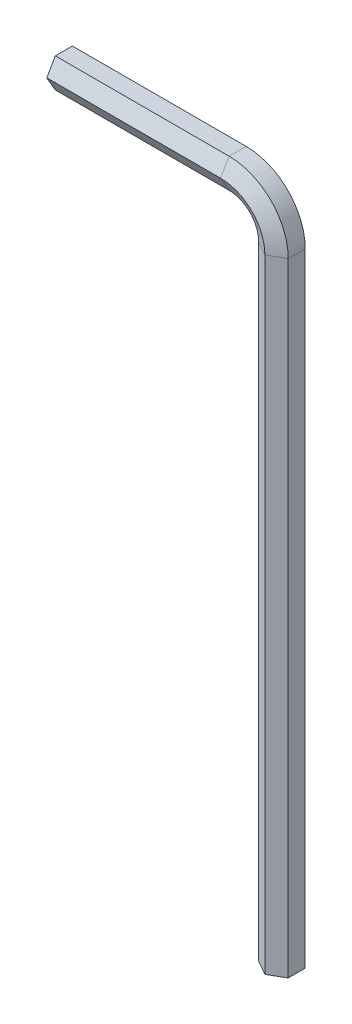
ISO-10303-21;
HEADER;
FILE_DESCRIPTION(('STEP AP214'),'2;1');
FILE_NAME('part.step','',(''),(''),'','','');
FILE_SCHEMA(('AUTOMOTIVE_DESIGN { 1 0 10303 214 1 1 1 1 }'));
ENDSEC;
DATA;
#1=APPLICATION_CONTEXT('core data for automotive mechanical design processes');
#2=APPLICATION_PROTOCOL_DEFINITION('international standard','automotive_design',2000,#1);
#3=PRODUCT_CONTEXT('',#1,'mechanical');
#4=PRODUCT('Part','Part','',(#3));
#5=PRODUCT_RELATED_PRODUCT_CATEGORY('part','',(#4));
#6=PRODUCT_DEFINITION_FORMATION('','',#4);
#7=PRODUCT_DEFINITION_CONTEXT('part definition',#1,'design');
#8=PRODUCT_DEFINITION('design','',#6,#7);
#9=PRODUCT_DEFINITION_SHAPE('','',#8);
#10=(LENGTH_UNIT() NAMED_UNIT(*) SI_UNIT(.MILLI.,.METRE.));
#11=(NAMED_UNIT(*) PLANE_ANGLE_UNIT() SI_UNIT($,.RADIAN.));
#12=(NAMED_UNIT(*) SI_UNIT($,.STERADIAN.) SOLID_ANGLE_UNIT());
#13=UNCERTAINTY_MEASURE_WITH_UNIT(LENGTH_MEASURE(1.E-05),#10,'distance_accuracy_value','');
#14=(GEOMETRIC_REPRESENTATION_CONTEXT(3) GLOBAL_UNCERTAINTY_ASSIGNED_CONTEXT((#13)) GLOBAL_UNIT_ASSIGNED_CONTEXT((#10,
#11,#12)) REPRESENTATION_CONTEXT('',''));
#15=CARTESIAN_POINT('',(0.,0.,0.));
#16=DIRECTION('',(0.,0.,1.));
#17=DIRECTION('',(1.,0.,0.));
#18=AXIS2_PLACEMENT_3D('',#15,#16,#17);
#19=CARTESIAN_POINT('',(0.,0.,0.));
#20=DIRECTION('',(0.,1.,0.));
#21=DIRECTION('',(0.,0.,1.));
#22=AXIS2_PLACEMENT_3D('',#19,#20,#21);
#23=PLANE('',#22);
#24=DIRECTION('',(-0.866025403784439,0.,-0.5));
#25=VECTOR('',#24,1.);
#26=CARTESIAN_POINT('',(1.25,0.,-0.721687836487033));
#27=LINE('',#26,#25);
#28=CARTESIAN_POINT('',(1.25,0.,-0.721687836487033));
#29=VERTEX_POINT('',#28);
#30=CARTESIAN_POINT('',(0.,0.,-1.44337567297406));
#31=VERTEX_POINT('',#30);
#32=EDGE_CURVE('E184',#29,#31,#27,.T.);
#33=ORIENTED_EDGE('',*,*,#32,.F.);
#34=DIRECTION('',(0.,0.,-1.));
#35=VECTOR('',#34,1.);
#36=CARTESIAN_POINT('',(1.25,0.,0.721687836487032));
#37=LINE('',#36,#35);
#38=CARTESIAN_POINT('',(1.25,0.,0.721687836487032));
#39=VERTEX_POINT('',#38);
#40=EDGE_CURVE('E226',#39,#29,#37,.T.);
#41=ORIENTED_EDGE('',*,*,#40,.F.);
#42=DIRECTION('',(0.866025403784439,0.,-0.5));
#43=VECTOR('',#42,1.);
#44=CARTESIAN_POINT('',(0.,0.,1.44337567297406));
#45=LINE('',#44,#43);
#46=CARTESIAN_POINT('',(0.,0.,1.44337567297406));
#47=VERTEX_POINT('',#46);
#48=EDGE_CURVE('E213',#47,#39,#45,.T.);
#49=ORIENTED_EDGE('',*,*,#48,.F.);
#50=DIRECTION('',(0.866025403784439,0.,0.5));
#51=VECTOR('',#50,1.);
#52=CARTESIAN_POINT('',(-1.25,0.,0.721687836487032));
#53=LINE('',#52,#51);
#54=CARTESIAN_POINT('',(-1.25,0.,0.721687836487032));
#55=VERTEX_POINT('',#54);
#56=EDGE_CURVE('E136',#55,#47,#53,.T.);
#57=ORIENTED_EDGE('',*,*,#56,.F.);
#58=DIRECTION('',(0.,0.,1.));
#59=VECTOR('',#58,1.);
#60=CARTESIAN_POINT('',(-1.25,0.,-0.721687836487032));
#61=LINE('',#60,#59);
#62=CARTESIAN_POINT('',(-1.25,0.,-0.721687836487032));
#63=VERTEX_POINT('',#62);
#64=EDGE_CURVE('E140',#63,#55,#61,.T.);
#65=ORIENTED_EDGE('',*,*,#64,.F.);
#66=DIRECTION('',(-0.866025403784438,0.,0.5));
#67=VECTOR('',#66,1.);
#68=CARTESIAN_POINT('',(0.,0.,-1.44337567297406));
#69=LINE('',#68,#67);
#70=EDGE_CURVE('E145',#31,#63,#69,.T.);
#71=ORIENTED_EDGE('',*,*,#70,.F.);
#72=EDGE_LOOP('',(#33,#41,#49,#57,#65,#71));
#73=FACE_BOUND('',#72,.T.);
#74=ADVANCED_FACE('F35',(#73),#23,.F.);
#75=CARTESIAN_POINT('',(-18.45,56.45,0.));
#76=DIRECTION('',(-1.,0.,0.));
#77=DIRECTION('',(0.,0.,1.));
#78=AXIS2_PLACEMENT_3D('',#75,#76,#77);
#79=PLANE('',#78);
#80=DIRECTION('',(0.,-0.866025403784439,-0.5));
#81=VECTOR('',#80,1.);
#82=CARTESIAN_POINT('',(-18.45,57.7,-0.721687836487033));
#83=LINE('',#82,#81);
#84=CARTESIAN_POINT('',(-18.45,57.7,-0.721687836487033));
#85=VERTEX_POINT('',#84);
#86=CARTESIAN_POINT('',(-18.45,56.45,-1.44337567297406));
#87=VERTEX_POINT('',#86);
#88=EDGE_CURVE('E156',#85,#87,#83,.T.);
#89=ORIENTED_EDGE('',*,*,#88,.T.);
#90=DIRECTION('',(0.,-0.866025403784438,0.5));
#91=VECTOR('',#90,1.);
#92=CARTESIAN_POINT('',(-18.45,56.45,-1.44337567297406));
#93=LINE('',#92,#91);
#94=CARTESIAN_POINT('',(-18.45,55.2,-0.721687836487032));
#95=VERTEX_POINT('',#94);
#96=EDGE_CURVE('E159',#87,#95,#93,.T.);
#97=ORIENTED_EDGE('',*,*,#96,.T.);
#98=DIRECTION('',(0.,0.,1.));
#99=VECTOR('',#98,1.);
#100=CARTESIAN_POINT('',(-18.45,55.2,-0.721687836487032));
#101=LINE('',#100,#99);
#102=CARTESIAN_POINT('',(-18.45,55.2,0.721687836487032));
#103=VERTEX_POINT('',#102);
#104=EDGE_CURVE('E199',#95,#103,#101,.T.);
#105=ORIENTED_EDGE('',*,*,#104,.T.);
#106=DIRECTION('',(0.,0.866025403784439,0.5));
#107=VECTOR('',#106,1.);
#108=CARTESIAN_POINT('',(-18.45,55.2,0.721687836487032));
#109=LINE('',#108,#107);
#110=CARTESIAN_POINT('',(-18.45,56.45,1.44337567297406));
#111=VERTEX_POINT('',#110);
#112=EDGE_CURVE('E54',#103,#111,#109,.T.);
#113=ORIENTED_EDGE('',*,*,#112,.T.);
#114=DIRECTION('',(0.,0.866025403784439,-0.5));
#115=VECTOR('',#114,1.);
#116=CARTESIAN_POINT('',(-18.45,56.45,1.44337567297406));
#117=LINE('',#116,#115);
#118=CARTESIAN_POINT('',(-18.45,57.7,0.721687836487032));
#119=VERTEX_POINT('',#118);
#120=EDGE_CURVE('E48',#111,#119,#117,.T.);
#121=ORIENTED_EDGE('',*,*,#120,.T.);
#122=DIRECTION('',(0.,0.,-1.));
#123=VECTOR('',#122,1.);
#124=CARTESIAN_POINT('',(-18.45,57.7,0.721687836487032));
#125=LINE('',#124,#123);
#126=EDGE_CURVE('E11',#119,#85,#125,.T.);
#127=ORIENTED_EDGE('',*,*,#126,.T.);
#128=EDGE_LOOP('',(#89,#97,#105,#113,#121,#127));
#129=FACE_BOUND('',#128,.T.);
#130=ADVANCED_FACE('F158',(#129),#79,.T.);
#131=CARTESIAN_POINT('',(1.25,0.,-0.721687836487033));
#132=DIRECTION('',(0.5,0.,-0.866025403784439));
#133=DIRECTION('',(-0.866025403784439,0.,-0.5));
#134=AXIS2_PLACEMENT_3D('',#131,#132,#133);
#135=PLANE('',#134);
#136=DIRECTION('',(0.,1.,0.));
#137=VECTOR('',#136,1.);
#138=CARTESIAN_POINT('',(0.,0.,-1.44337567297406));
#139=LINE('',#138,#137);
#140=CARTESIAN_POINT('',(0.,52.7,-1.44337567297406));
#141=VERTEX_POINT('',#140);
#142=EDGE_CURVE('E189',#31,#141,#139,.T.);
#143=ORIENTED_EDGE('',*,*,#142,.T.);
#144=DIRECTION('',(-0.866025403784439,0.,-0.5));
#145=VECTOR('',#144,1.);
#146=CARTESIAN_POINT('',(1.25,52.7,-0.721687836487033));
#147=LINE('',#146,#145);
#148=CARTESIAN_POINT('',(1.25,52.7,-0.721687836487033));
#149=VERTEX_POINT('',#148);
#150=EDGE_CURVE('E258',#149,#141,#147,.T.);
#151=ORIENTED_EDGE('',*,*,#150,.F.);
#152=DIRECTION('',(0.,1.,0.));
#153=VECTOR('',#152,1.);
#154=CARTESIAN_POINT('',(1.25,0.,-0.721687836487033));
#155=LINE('',#154,#153);
#156=EDGE_CURVE('E240',#29,#149,#155,.T.);
#157=ORIENTED_EDGE('',*,*,#156,.F.);
#158=ORIENTED_EDGE('',*,*,#32,.T.);
#159=EDGE_LOOP('',(#143,#151,#157,#158));
#160=FACE_BOUND('',#159,.T.);
#161=ADVANCED_FACE('F265',(#160),#135,.T.);
#162=CARTESIAN_POINT('',(0.,0.,-1.44337567297406));
#163=DIRECTION('',(-0.5,0.,-0.866025403784438));
#164=DIRECTION('',(-0.866025403784439,0.,0.5));
#165=AXIS2_PLACEMENT_3D('',#162,#163,#164);
#166=PLANE('',#165);
#167=DIRECTION('',(0.,1.,0.));
#168=VECTOR('',#167,1.);
#169=CARTESIAN_POINT('',(-1.25,0.,-0.721687836487032));
#170=LINE('',#169,#168);
#171=CARTESIAN_POINT('',(-1.25,52.7,-0.721687836487032));
#172=VERTEX_POINT('',#171);
#173=EDGE_CURVE('E188',#63,#172,#170,.T.);
#174=ORIENTED_EDGE('',*,*,#173,.T.);
#175=DIRECTION('',(-0.866025403784438,0.,0.5));
#176=VECTOR('',#175,1.);
#177=CARTESIAN_POINT('',(0.,52.7,-1.44337567297406));
#178=LINE('',#177,#176);
#179=EDGE_CURVE('E185',#141,#172,#178,.T.);
#180=ORIENTED_EDGE('',*,*,#179,.F.);
#181=ORIENTED_EDGE('',*,*,#142,.F.);
#182=ORIENTED_EDGE('',*,*,#70,.T.);
#183=EDGE_LOOP('',(#174,#180,#181,#182));
#184=FACE_BOUND('',#183,.T.);
#185=ADVANCED_FACE('F268',(#184),#166,.T.);
#186=CARTESIAN_POINT('',(-1.25,0.,-0.721687836487032));
#187=DIRECTION('',(-1.,0.,0.));
#188=DIRECTION('',(0.,-1.,0.));
#189=AXIS2_PLACEMENT_3D('',#186,#187,#188);
#190=PLANE('',#189);
#191=DIRECTION('',(0.,1.,0.));
#192=VECTOR('',#191,1.);
#193=CARTESIAN_POINT('',(-1.25,0.,0.721687836487032));
#194=LINE('',#193,#192);
#195=CARTESIAN_POINT('',(-1.25,52.7,0.721687836487032));
#196=VERTEX_POINT('',#195);
#197=EDGE_CURVE('E202',#55,#196,#194,.T.);
#198=ORIENTED_EDGE('',*,*,#197,.T.);
#199=DIRECTION('',(0.,0.,1.));
#200=VECTOR('',#199,1.);
#201=CARTESIAN_POINT('',(-1.25,52.7,-0.721687836487032));
#202=LINE('',#201,#200);
#203=EDGE_CURVE('E192',#172,#196,#202,.T.);
#204=ORIENTED_EDGE('',*,*,#203,.F.);
#205=ORIENTED_EDGE('',*,*,#173,.F.);
#206=ORIENTED_EDGE('',*,*,#64,.T.);
#207=EDGE_LOOP('',(#198,#204,#205,#206));
#208=FACE_BOUND('',#207,.T.);
#209=ADVANCED_FACE('F322',(#208),#190,.T.);
#210=CARTESIAN_POINT('',(-1.25,0.,0.721687836487032));
#211=DIRECTION('',(-0.5,0.,0.866025403784439));
#212=DIRECTION('',(0.866025403784439,0.,0.5));
#213=AXIS2_PLACEMENT_3D('',#210,#211,#212);
#214=PLANE('',#213);
#215=DIRECTION('',(0.,1.,0.));
#216=VECTOR('',#215,1.);
#217=CARTESIAN_POINT('',(0.,0.,1.44337567297406));
#218=LINE('',#217,#216);
#219=CARTESIAN_POINT('',(0.,52.7,1.44337567297406));
#220=VERTEX_POINT('',#219);
#221=EDGE_CURVE('E215',#47,#220,#218,.T.);
#222=ORIENTED_EDGE('',*,*,#221,.T.);
#223=DIRECTION('',(0.866025403784439,0.,0.5));
#224=VECTOR('',#223,1.);
#225=CARTESIAN_POINT('',(-1.25,52.7,0.721687836487032));
#226=LINE('',#225,#224);
#227=EDGE_CURVE('E205',#196,#220,#226,.T.);
#228=ORIENTED_EDGE('',*,*,#227,.F.);
#229=ORIENTED_EDGE('',*,*,#197,.F.);
#230=ORIENTED_EDGE('',*,*,#56,.T.);
#231=EDGE_LOOP('',(#222,#228,#229,#230));
#232=FACE_BOUND('',#231,.T.);
#233=ADVANCED_FACE('F330',(#232),#214,.T.);
#234=CARTESIAN_POINT('',(0.,0.,1.44337567297406));
#235=DIRECTION('',(0.5,0.,0.866025403784439));
#236=DIRECTION('',(0.866025403784439,0.,-0.5));
#237=AXIS2_PLACEMENT_3D('',#234,#235,#236);
#238=PLANE('',#237);
#239=DIRECTION('',(0.,1.,0.));
#240=VECTOR('',#239,1.);
#241=CARTESIAN_POINT('',(1.25,0.,0.721687836487032));
#242=LINE('',#241,#240);
#243=CARTESIAN_POINT('',(1.25,52.7,0.721687836487032));
#244=VERTEX_POINT('',#243);
#245=EDGE_CURVE('E228',#39,#244,#242,.T.);
#246=ORIENTED_EDGE('',*,*,#245,.T.);
#247=DIRECTION('',(0.866025403784439,0.,-0.5));
#248=VECTOR('',#247,1.);
#249=CARTESIAN_POINT('',(0.,52.7,1.44337567297406));
#250=LINE('',#249,#248);
#251=EDGE_CURVE('E218',#220,#244,#250,.T.);
#252=ORIENTED_EDGE('',*,*,#251,.F.);
#253=ORIENTED_EDGE('',*,*,#221,.F.);
#254=ORIENTED_EDGE('',*,*,#48,.T.);
#255=EDGE_LOOP('',(#246,#252,#253,#254));
#256=FACE_BOUND('',#255,.T.);
#257=ADVANCED_FACE('F340',(#256),#238,.T.);
#258=CARTESIAN_POINT('',(1.25,0.,0.721687836487032));
#259=DIRECTION('',(1.,0.,0.));
#260=DIRECTION('',(0.,1.,0.));
#261=AXIS2_PLACEMENT_3D('',#258,#259,#260);
#262=PLANE('',#261);
#263=DIRECTION('',(0.,0.,-1.));
#264=VECTOR('',#263,1.);
#265=CARTESIAN_POINT('',(1.25,52.7,0.721687836487032));
#266=LINE('',#265,#264);
#267=EDGE_CURVE('E231',#244,#149,#266,.T.);
#268=ORIENTED_EDGE('',*,*,#267,.F.);
#269=ORIENTED_EDGE('',*,*,#245,.F.);
#270=ORIENTED_EDGE('',*,*,#40,.T.);
#271=ORIENTED_EDGE('',*,*,#156,.T.);
#272=EDGE_LOOP('',(#268,#269,#270,#271));
#273=FACE_BOUND('',#272,.T.);
#274=ADVANCED_FACE('F281',(#273),#262,.T.);
#275=CARTESIAN_POINT('',(-3.75,52.7,-0.721687836487033));
#276=DIRECTION('',(0.,0.,1.));
#277=DIRECTION('',(1.,0.,0.));
#278=AXIS2_PLACEMENT_3D('',#275,#276,#277);
#279=CONICAL_SURFACE('',#278,5.,1.0471975511966);
#280=CARTESIAN_POINT('',(-3.75,52.7,-1.44337567297406));
#281=DIRECTION('',(0.,0.,1.));
#282=DIRECTION('',(1.,0.,0.));
#283=AXIS2_PLACEMENT_3D('',#280,#281,#282);
#284=CIRCLE('',#283,3.75);
#285=CARTESIAN_POINT('',(-3.75,56.45,-1.44337567297406));
#286=VERTEX_POINT('',#285);
#287=EDGE_CURVE('E195',#141,#286,#284,.T.);
#288=ORIENTED_EDGE('',*,*,#287,.T.);
#289=DIRECTION('',(0.,-0.866025403784439,-0.5));
#290=VECTOR('',#289,1.);
#291=CARTESIAN_POINT('',(-3.75,57.7,-0.721687836487033));
#292=LINE('',#291,#290);
#293=CARTESIAN_POINT('',(-3.75,57.7,-0.721687836487033));
#294=VERTEX_POINT('',#293);
#295=EDGE_CURVE('E177',#294,#286,#292,.T.);
#296=ORIENTED_EDGE('',*,*,#295,.F.);
#297=CARTESIAN_POINT('',(-3.75,52.7,-0.721687836487033));
#298=DIRECTION('',(0.,0.,1.));
#299=DIRECTION('',(1.,0.,0.));
#300=AXIS2_PLACEMENT_3D('',#297,#298,#299);
#301=CIRCLE('',#300,5.);
#302=EDGE_CURVE('E242',#149,#294,#301,.T.);
#303=ORIENTED_EDGE('',*,*,#302,.F.);
#304=ORIENTED_EDGE('',*,*,#150,.T.);
#305=EDGE_LOOP('',(#288,#296,#303,#304));
#306=FACE_BOUND('',#305,.T.);
#307=ADVANCED_FACE('F248',(#306),#279,.T.);
#308=CARTESIAN_POINT('',(-3.75,52.7,-1.44337567297406));
#309=DIRECTION('',(0.,0.,-1.));
#310=DIRECTION('',(-1.,0.,0.));
#311=AXIS2_PLACEMENT_3D('',#308,#309,#310);
#312=CONICAL_SURFACE('',#311,3.75,1.0471975511966);
#313=CARTESIAN_POINT('',(-3.75,52.7,-0.721687836487032));
#314=DIRECTION('',(0.,0.,1.));
#315=DIRECTION('',(1.,0.,0.));
#316=AXIS2_PLACEMENT_3D('',#313,#314,#315);
#317=CIRCLE('',#316,2.5);
#318=CARTESIAN_POINT('',(-3.75,55.2,-0.721687836487032));
#319=VERTEX_POINT('',#318);
#320=EDGE_CURVE('E123',#172,#319,#317,.T.);
#321=ORIENTED_EDGE('',*,*,#320,.T.);
#322=DIRECTION('',(0.,-0.866025403784438,0.5));
#323=VECTOR('',#322,1.);
#324=CARTESIAN_POINT('',(-3.75,56.45,-1.44337567297406));
#325=LINE('',#324,#323);
#326=EDGE_CURVE('E193',#286,#319,#325,.T.);
#327=ORIENTED_EDGE('',*,*,#326,.F.);
#328=ORIENTED_EDGE('',*,*,#287,.F.);
#329=ORIENTED_EDGE('',*,*,#179,.T.);
#330=EDGE_LOOP('',(#321,#327,#328,#329));
#331=FACE_BOUND('',#330,.T.);
#332=ADVANCED_FACE('F271',(#331),#312,.F.);
#333=CARTESIAN_POINT('',(-3.75,52.7,0.));
#334=DIRECTION('',(0.,0.,1.));
#335=DIRECTION('',(1.,0.,0.));
#336=AXIS2_PLACEMENT_3D('',#333,#334,#335);
#337=CYLINDRICAL_SURFACE('',#336,2.5);
#338=CARTESIAN_POINT('',(-3.75,52.7,0.721687836487032));
#339=DIRECTION('',(0.,0.,1.));
#340=DIRECTION('',(1.,0.,0.));
#341=AXIS2_PLACEMENT_3D('',#338,#339,#340);
#342=CIRCLE('',#341,2.5);
#343=CARTESIAN_POINT('',(-3.75,55.2,0.721687836487032));
#344=VERTEX_POINT('',#343);
#345=EDGE_CURVE('E114',#196,#344,#342,.T.);
#346=ORIENTED_EDGE('',*,*,#345,.T.);
#347=DIRECTION('',(0.,0.,1.));
#348=VECTOR('',#347,1.);
#349=CARTESIAN_POINT('',(-3.75,55.2,-0.721687836487032));
#350=LINE('',#349,#348);
#351=EDGE_CURVE('E196',#319,#344,#350,.T.);
#352=ORIENTED_EDGE('',*,*,#351,.F.);
#353=ORIENTED_EDGE('',*,*,#320,.F.);
#354=ORIENTED_EDGE('',*,*,#203,.T.);
#355=EDGE_LOOP('',(#346,#352,#353,#354));
#356=FACE_BOUND('',#355,.T.);
#357=ADVANCED_FACE('F273',(#356),#337,.F.);
#358=CARTESIAN_POINT('',(-3.75,52.7,0.721687836487032));
#359=DIRECTION('',(0.,0.,1.));
#360=DIRECTION('',(1.,0.,0.));
#361=AXIS2_PLACEMENT_3D('',#358,#359,#360);
#362=CONICAL_SURFACE('',#361,2.5,1.0471975511966);
#363=CARTESIAN_POINT('',(-3.75,52.7,1.44337567297406));
#364=DIRECTION('',(0.,0.,1.));
#365=DIRECTION('',(1.,0.,0.));
#366=AXIS2_PLACEMENT_3D('',#363,#364,#365);
#367=CIRCLE('',#366,3.75);
#368=CARTESIAN_POINT('',(-3.75,56.45,1.44337567297406));
#369=VERTEX_POINT('',#368);
#370=EDGE_CURVE('E107',#220,#369,#367,.T.);
#371=ORIENTED_EDGE('',*,*,#370,.T.);
#372=DIRECTION('',(0.,0.866025403784439,0.5));
#373=VECTOR('',#372,1.);
#374=CARTESIAN_POINT('',(-3.75,55.2,0.721687836487032));
#375=LINE('',#374,#373);
#376=EDGE_CURVE('E209',#344,#369,#375,.T.);
#377=ORIENTED_EDGE('',*,*,#376,.F.);
#378=ORIENTED_EDGE('',*,*,#345,.F.);
#379=ORIENTED_EDGE('',*,*,#227,.T.);
#380=EDGE_LOOP('',(#371,#377,#378,#379));
#381=FACE_BOUND('',#380,.T.);
#382=ADVANCED_FACE('F279',(#381),#362,.F.);
#383=CARTESIAN_POINT('',(-3.75,52.7,1.44337567297406));
#384=DIRECTION('',(0.,0.,-1.));
#385=DIRECTION('',(-1.,0.,0.));
#386=AXIS2_PLACEMENT_3D('',#383,#384,#385);
#387=CONICAL_SURFACE('',#386,3.75,1.0471975511966);
#388=CARTESIAN_POINT('',(-3.75,52.7,0.721687836487032));
#389=DIRECTION('',(0.,0.,1.));
#390=DIRECTION('',(1.,0.,0.));
#391=AXIS2_PLACEMENT_3D('',#388,#389,#390);
#392=CIRCLE('',#391,5.);
#393=CARTESIAN_POINT('',(-3.75,57.7,0.721687836487032));
#394=VERTEX_POINT('',#393);
#395=EDGE_CURVE('E233',#244,#394,#392,.T.);
#396=ORIENTED_EDGE('',*,*,#395,.T.);
#397=DIRECTION('',(0.,0.866025403784439,-0.5));
#398=VECTOR('',#397,1.);
#399=CARTESIAN_POINT('',(-3.75,56.45,1.44337567297406));
#400=LINE('',#399,#398);
#401=EDGE_CURVE('E221',#369,#394,#400,.T.);
#402=ORIENTED_EDGE('',*,*,#401,.F.);
#403=ORIENTED_EDGE('',*,*,#370,.F.);
#404=ORIENTED_EDGE('',*,*,#251,.T.);
#405=EDGE_LOOP('',(#396,#402,#403,#404));
#406=FACE_BOUND('',#405,.T.);
#407=ADVANCED_FACE('F383',(#406),#387,.T.);
#408=CARTESIAN_POINT('',(-3.75,52.7,0.));
#409=DIRECTION('',(0.,0.,1.));
#410=DIRECTION('',(1.,0.,0.));
#411=AXIS2_PLACEMENT_3D('',#408,#409,#410);
#412=CYLINDRICAL_SURFACE('',#411,5.);
#413=DIRECTION('',(0.,0.,-1.));
#414=VECTOR('',#413,1.);
#415=CARTESIAN_POINT('',(-3.75,57.7,0.721687836487032));
#416=LINE('',#415,#414);
#417=EDGE_CURVE('E182',#394,#294,#416,.T.);
#418=ORIENTED_EDGE('',*,*,#417,.F.);
#419=ORIENTED_EDGE('',*,*,#395,.F.);
#420=ORIENTED_EDGE('',*,*,#267,.T.);
#421=ORIENTED_EDGE('',*,*,#302,.T.);
#422=EDGE_LOOP('',(#418,#419,#420,#421));
#423=FACE_BOUND('',#422,.T.);
#424=ADVANCED_FACE('F251',(#423),#412,.T.);
#425=CARTESIAN_POINT('',(-3.75,57.7,-0.721687836487033));
#426=DIRECTION('',(0.,0.5,-0.866025403784439));
#427=DIRECTION('',(0.,0.866025403784439,0.5));
#428=AXIS2_PLACEMENT_3D('',#425,#426,#427);
#429=PLANE('',#428);
#430=DIRECTION('',(-1.,0.,0.));
#431=VECTOR('',#430,1.);
#432=CARTESIAN_POINT('',(-3.75,56.45,-1.44337567297406));
#433=LINE('',#432,#431);
#434=EDGE_CURVE('E164',#286,#87,#433,.T.);
#435=ORIENTED_EDGE('',*,*,#434,.T.);
#436=ORIENTED_EDGE('',*,*,#88,.F.);
#437=DIRECTION('',(-1.,0.,0.));
#438=VECTOR('',#437,1.);
#439=CARTESIAN_POINT('',(-3.75,57.7,-0.721687836487033));
#440=LINE('',#439,#438);
#441=EDGE_CURVE('E165',#294,#85,#440,.T.);
#442=ORIENTED_EDGE('',*,*,#441,.F.);
#443=ORIENTED_EDGE('',*,*,#295,.T.);
#444=EDGE_LOOP('',(#435,#436,#442,#443));
#445=FACE_BOUND('',#444,.T.);
#446=ADVANCED_FACE('F175',(#445),#429,.T.);
#447=CARTESIAN_POINT('',(-3.75,56.45,-1.44337567297406));
#448=DIRECTION('',(0.,-0.5,-0.866025403784439));
#449=DIRECTION('',(0.,0.866025403784439,-0.5));
#450=AXIS2_PLACEMENT_3D('',#447,#448,#449);
#451=PLANE('',#450);
#452=DIRECTION('',(-1.,0.,0.));
#453=VECTOR('',#452,1.);
#454=CARTESIAN_POINT('',(-3.75,55.2,-0.721687836487032));
#455=LINE('',#454,#453);
#456=EDGE_CURVE('E172',#319,#95,#455,.T.);
#457=ORIENTED_EDGE('',*,*,#456,.T.);
#458=ORIENTED_EDGE('',*,*,#96,.F.);
#459=ORIENTED_EDGE('',*,*,#434,.F.);
#460=ORIENTED_EDGE('',*,*,#326,.T.);
#461=EDGE_LOOP('',(#457,#458,#459,#460));
#462=FACE_BOUND('',#461,.T.);
#463=ADVANCED_FACE('F169',(#462),#451,.T.);
#464=CARTESIAN_POINT('',(-3.75,55.2,-0.721687836487032));
#465=DIRECTION('',(0.,-1.,0.));
#466=DIRECTION('',(1.,0.,0.));
#467=AXIS2_PLACEMENT_3D('',#464,#465,#466);
#468=PLANE('',#467);
#469=DIRECTION('',(-1.,0.,0.));
#470=VECTOR('',#469,1.);
#471=CARTESIAN_POINT('',(-3.75,55.2,0.721687836487032));
#472=LINE('',#471,#470);
#473=EDGE_CURVE('E92',#344,#103,#472,.T.);
#474=ORIENTED_EDGE('',*,*,#473,.T.);
#475=ORIENTED_EDGE('',*,*,#104,.F.);
#476=ORIENTED_EDGE('',*,*,#456,.F.);
#477=ORIENTED_EDGE('',*,*,#351,.T.);
#478=EDGE_LOOP('',(#474,#475,#476,#477));
#479=FACE_BOUND('',#478,.T.);
#480=ADVANCED_FACE('F415',(#479),#468,.T.);
#481=CARTESIAN_POINT('',(-3.75,55.2,0.721687836487032));
#482=DIRECTION('',(0.,-0.5,0.866025403784439));
#483=DIRECTION('',(0.,-0.866025403784439,-0.5));
#484=AXIS2_PLACEMENT_3D('',#481,#482,#483);
#485=PLANE('',#484);
#486=DIRECTION('',(-1.,0.,0.));
#487=VECTOR('',#486,1.);
#488=CARTESIAN_POINT('',(-3.75,56.45,1.44337567297406));
#489=LINE('',#488,#487);
#490=EDGE_CURVE('E84',#369,#111,#489,.T.);
#491=ORIENTED_EDGE('',*,*,#490,.T.);
#492=ORIENTED_EDGE('',*,*,#112,.F.);
#493=ORIENTED_EDGE('',*,*,#473,.F.);
#494=ORIENTED_EDGE('',*,*,#376,.T.);
#495=EDGE_LOOP('',(#491,#492,#493,#494));
#496=FACE_BOUND('',#495,.T.);
#497=ADVANCED_FACE('F291',(#496),#485,.T.);
#498=CARTESIAN_POINT('',(-3.75,56.45,1.44337567297406));
#499=DIRECTION('',(0.,0.5,0.866025403784439));
#500=DIRECTION('',(0.,-0.866025403784439,0.5));
#501=AXIS2_PLACEMENT_3D('',#498,#499,#500);
#502=PLANE('',#501);
#503=DIRECTION('',(-1.,0.,0.));
#504=VECTOR('',#503,1.);
#505=CARTESIAN_POINT('',(-3.75,57.7,0.721687836487032));
#506=LINE('',#505,#504);
#507=EDGE_CURVE('E42',#394,#119,#506,.T.);
#508=ORIENTED_EDGE('',*,*,#507,.T.);
#509=ORIENTED_EDGE('',*,*,#120,.F.);
#510=ORIENTED_EDGE('',*,*,#490,.F.);
#511=ORIENTED_EDGE('',*,*,#401,.T.);
#512=EDGE_LOOP('',(#508,#509,#510,#511));
#513=FACE_BOUND('',#512,.T.);
#514=ADVANCED_FACE('F286',(#513),#502,.T.);
#515=CARTESIAN_POINT('',(-3.75,57.7,0.721687836487032));
#516=DIRECTION('',(0.,1.,0.));
#517=DIRECTION('',(-1.,0.,0.));
#518=AXIS2_PLACEMENT_3D('',#515,#516,#517);
#519=PLANE('',#518);
#520=ORIENTED_EDGE('',*,*,#126,.F.);
#521=ORIENTED_EDGE('',*,*,#507,.F.);
#522=ORIENTED_EDGE('',*,*,#417,.T.);
#523=ORIENTED_EDGE('',*,*,#441,.T.);
#524=EDGE_LOOP('',(#520,#521,#522,#523));
#525=FACE_BOUND('',#524,.T.);
#526=ADVANCED_FACE('F243',(#525),#519,.T.);
#527=CLOSED_SHELL('',(#74,#130,#161,#185,#209,#233,#257,#274,#307,#332,#357,#382,#407,#424,#446,
#463,#480,#497,#514,#526));
#528=MANIFOLD_SOLID_BREP('B2',#527);
#529=ADVANCED_BREP_SHAPE_REPRESENTATION('',(#18,#528),#14);
#530=SHAPE_DEFINITION_REPRESENTATION(#9,#529);
ENDSEC;
END-ISO-10303-21;
